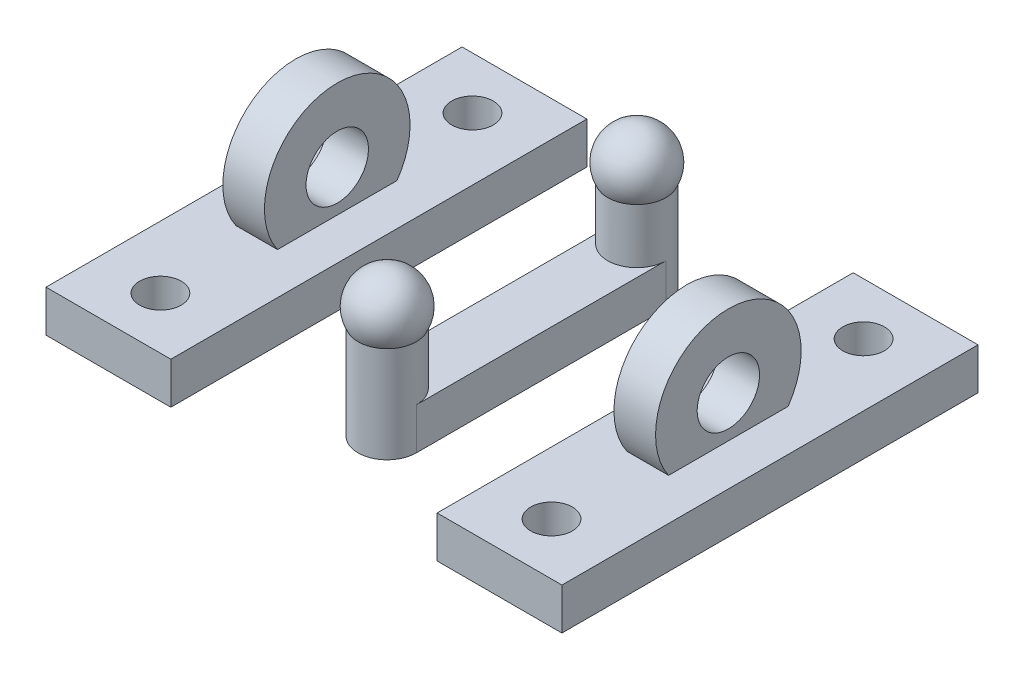
ISO-10303-21;
HEADER;
FILE_DESCRIPTION(('STEP AP214'),'2;1');
FILE_NAME('part.step','',(''),(''),'','','');
FILE_SCHEMA(('AUTOMOTIVE_DESIGN { 1 0 10303 214 1 1 1 1 }'));
ENDSEC;
DATA;
#1=APPLICATION_CONTEXT('core data for automotive mechanical design processes');
#2=APPLICATION_PROTOCOL_DEFINITION('international standard','automotive_design',2000,#1);
#3=PRODUCT_CONTEXT('',#1,'mechanical');
#4=PRODUCT('Part','Part','',(#3));
#5=PRODUCT_RELATED_PRODUCT_CATEGORY('part','',(#4));
#6=PRODUCT_DEFINITION_FORMATION('','',#4);
#7=PRODUCT_DEFINITION_CONTEXT('part definition',#1,'design');
#8=PRODUCT_DEFINITION('design','',#6,#7);
#9=PRODUCT_DEFINITION_SHAPE('','',#8);
#10=(LENGTH_UNIT() NAMED_UNIT(*) SI_UNIT(.MILLI.,.METRE.));
#11=(NAMED_UNIT(*) PLANE_ANGLE_UNIT() SI_UNIT($,.RADIAN.));
#12=(NAMED_UNIT(*) SI_UNIT($,.STERADIAN.) SOLID_ANGLE_UNIT());
#13=UNCERTAINTY_MEASURE_WITH_UNIT(LENGTH_MEASURE(1.E-05),#10,'distance_accuracy_value','');
#14=(GEOMETRIC_REPRESENTATION_CONTEXT(3) GLOBAL_UNCERTAINTY_ASSIGNED_CONTEXT((#13)) GLOBAL_UNIT_ASSIGNED_CONTEXT((#10,
#11,#12)) REPRESENTATION_CONTEXT('',''));
#15=CARTESIAN_POINT('',(0.,0.,0.));
#16=DIRECTION('',(0.,0.,1.));
#17=DIRECTION('',(1.,0.,0.));
#18=AXIS2_PLACEMENT_3D('',#15,#16,#17);
#19=CARTESIAN_POINT('',(0.,2.,0.));
#20=DIRECTION('',(0.,-1.,0.));
#21=DIRECTION('',(0.,0.,-1.));
#22=AXIS2_PLACEMENT_3D('',#19,#20,#21);
#23=PLANE('',#22);
#24=CARTESIAN_POINT('',(0.,2.,7.5));
#25=DIRECTION('',(0.,1.,0.));
#26=DIRECTION('',(0.,0.,1.));
#27=AXIS2_PLACEMENT_3D('',#24,#25,#26);
#28=CIRCLE('',#27,1.);
#29=CARTESIAN_POINT('',(0.,2.,8.5));
#30=VERTEX_POINT('',#29);
#31=EDGE_CURVE('P0_E184',#30,#30,#28,.T.);
#32=ORIENTED_EDGE('',*,*,#31,.F.);
#33=EDGE_LOOP('',(#32));
#34=FACE_BOUND('',#33,.T.);
#35=CARTESIAN_POINT('',(0.,2.,-7.5));
#36=DIRECTION('',(0.,1.,0.));
#37=DIRECTION('',(0.,0.,1.));
#38=AXIS2_PLACEMENT_3D('',#35,#36,#37);
#39=CIRCLE('',#38,1.);
#40=CARTESIAN_POINT('',(0.,2.,-6.5));
#41=VERTEX_POINT('',#40);
#42=EDGE_CURVE('P0_E185',#41,#41,#39,.T.);
#43=ORIENTED_EDGE('',*,*,#42,.F.);
#44=EDGE_LOOP('',(#43));
#45=FACE_BOUND('',#44,.T.);
#46=DIRECTION('',(-1.,0.,0.));
#47=VECTOR('',#46,1.);
#48=CARTESIAN_POINT('',(-3.,2.,-10.));
#49=LINE('',#48,#47);
#50=CARTESIAN_POINT('',(3.,2.,-10.));
#51=VERTEX_POINT('',#50);
#52=CARTESIAN_POINT('',(-3.,2.,-10.));
#53=VERTEX_POINT('',#52);
#54=EDGE_CURVE('P0_E68',#51,#53,#49,.T.);
#55=ORIENTED_EDGE('',*,*,#54,.T.);
#56=DIRECTION('',(0.,0.,1.));
#57=VECTOR('',#56,1.);
#58=CARTESIAN_POINT('',(-3.,2.,10.));
#59=LINE('',#58,#57);
#60=CARTESIAN_POINT('',(-3.,2.,10.));
#61=VERTEX_POINT('',#60);
#62=EDGE_CURVE('P0_E112',#53,#61,#59,.T.);
#63=ORIENTED_EDGE('',*,*,#62,.T.);
#64=DIRECTION('',(1.,0.,0.));
#65=VECTOR('',#64,1.);
#66=CARTESIAN_POINT('',(-3.,2.,10.));
#67=LINE('',#66,#65);
#68=CARTESIAN_POINT('',(3.,2.,10.));
#69=VERTEX_POINT('',#68);
#70=EDGE_CURVE('P0_E40',#61,#69,#67,.T.);
#71=ORIENTED_EDGE('',*,*,#70,.T.);
#72=DIRECTION('',(0.,0.,-1.));
#73=VECTOR('',#72,1.);
#74=CARTESIAN_POINT('',(3.,2.,10.));
#75=LINE('',#74,#73);
#76=EDGE_CURVE('P0_E109',#69,#51,#75,.T.);
#77=ORIENTED_EDGE('',*,*,#76,.T.);
#78=EDGE_LOOP('',(#55,#63,#71,#77));
#79=FACE_BOUND('',#78,.T.);
#80=DIRECTION('',(0.,0.,-1.));
#81=VECTOR('',#80,1.);
#82=CARTESIAN_POINT('',(1.,2.,0.));
#83=LINE('',#82,#81);
#84=CARTESIAN_POINT('',(1.,2.,2.87228132326901));
#85=VERTEX_POINT('',#84);
#86=CARTESIAN_POINT('',(1.,2.,-2.87228132326901));
#87=VERTEX_POINT('',#86);
#88=EDGE_CURVE('P0_E91',#85,#87,#83,.T.);
#89=ORIENTED_EDGE('',*,*,#88,.F.);
#90=DIRECTION('',(-1.,0.,0.));
#91=VECTOR('',#90,1.);
#92=CARTESIAN_POINT('',(1.,2.,2.87228132326901));
#93=LINE('',#92,#91);
#94=CARTESIAN_POINT('',(-1.,2.,2.87228132326901));
#95=VERTEX_POINT('',#94);
#96=EDGE_CURVE('P0_E82',#85,#95,#93,.T.);
#97=ORIENTED_EDGE('',*,*,#96,.T.);
#98=DIRECTION('',(0.,0.,-1.));
#99=VECTOR('',#98,1.);
#100=CARTESIAN_POINT('',(-1.,2.,0.));
#101=LINE('',#100,#99);
#102=CARTESIAN_POINT('',(-1.,2.,-2.87228132326901));
#103=VERTEX_POINT('',#102);
#104=EDGE_CURVE('P0_E77',#95,#103,#101,.T.);
#105=ORIENTED_EDGE('',*,*,#104,.T.);
#106=DIRECTION('',(-1.,0.,0.));
#107=VECTOR('',#106,1.);
#108=CARTESIAN_POINT('',(1.,2.,-2.87228132326901));
#109=LINE('',#108,#107);
#110=EDGE_CURVE('P0_E89',#87,#103,#109,.T.);
#111=ORIENTED_EDGE('',*,*,#110,.F.);
#112=EDGE_LOOP('',(#89,#97,#105,#111));
#113=FACE_BOUND('',#112,.T.);
#114=ADVANCED_FACE('P0_F17',(#34,#45,#79,#113),#23,.F.);
#115=CARTESIAN_POINT('',(3.,2.,10.));
#116=DIRECTION('',(-1.,0.,0.));
#117=DIRECTION('',(0.,0.,1.));
#118=AXIS2_PLACEMENT_3D('',#115,#116,#117);
#119=PLANE('',#118);
#120=DIRECTION('',(0.,0.,-1.));
#121=VECTOR('',#120,1.);
#122=CARTESIAN_POINT('',(3.,0.,10.));
#123=LINE('',#122,#121);
#124=CARTESIAN_POINT('',(3.,0.,10.));
#125=VERTEX_POINT('',#124);
#126=CARTESIAN_POINT('',(3.,0.,-10.));
#127=VERTEX_POINT('',#126);
#128=EDGE_CURVE('P0_E90',#125,#127,#123,.T.);
#129=ORIENTED_EDGE('',*,*,#128,.T.);
#130=DIRECTION('',(0.,-1.,0.));
#131=VECTOR('',#130,1.);
#132=CARTESIAN_POINT('',(3.,2.,-10.));
#133=LINE('',#132,#131);
#134=EDGE_CURVE('P0_E11',#51,#127,#133,.T.);
#135=ORIENTED_EDGE('',*,*,#134,.F.);
#136=ORIENTED_EDGE('',*,*,#76,.F.);
#137=DIRECTION('',(0.,-1.,0.));
#138=VECTOR('',#137,1.);
#139=CARTESIAN_POINT('',(3.,2.,10.));
#140=LINE('',#139,#138);
#141=EDGE_CURVE('P0_E115',#69,#125,#140,.T.);
#142=ORIENTED_EDGE('',*,*,#141,.T.);
#143=EDGE_LOOP('',(#129,#135,#136,#142));
#144=FACE_BOUND('',#143,.T.);
#145=ADVANCED_FACE('P0_F19',(#144),#119,.F.);
#146=CARTESIAN_POINT('',(-3.,2.,-10.));
#147=DIRECTION('',(0.,0.,1.));
#148=DIRECTION('',(1.,0.,0.));
#149=AXIS2_PLACEMENT_3D('',#146,#147,#148);
#150=PLANE('',#149);
#151=DIRECTION('',(0.,-1.,0.));
#152=VECTOR('',#151,1.);
#153=CARTESIAN_POINT('',(-3.,2.,-10.));
#154=LINE('',#153,#152);
#155=CARTESIAN_POINT('',(-3.,0.,-10.));
#156=VERTEX_POINT('',#155);
#157=EDGE_CURVE('P0_E25',#53,#156,#154,.T.);
#158=ORIENTED_EDGE('',*,*,#157,.F.);
#159=ORIENTED_EDGE('',*,*,#54,.F.);
#160=ORIENTED_EDGE('',*,*,#134,.T.);
#161=DIRECTION('',(-1.,0.,0.));
#162=VECTOR('',#161,1.);
#163=CARTESIAN_POINT('',(-3.,0.,-10.));
#164=LINE('',#163,#162);
#165=EDGE_CURVE('P0_E118',#127,#156,#164,.T.);
#166=ORIENTED_EDGE('',*,*,#165,.T.);
#167=EDGE_LOOP('',(#158,#159,#160,#166));
#168=FACE_BOUND('',#167,.T.);
#169=ADVANCED_FACE('P0_F148',(#168),#150,.F.);
#170=CARTESIAN_POINT('',(-3.,2.,10.));
#171=DIRECTION('',(1.,0.,0.));
#172=DIRECTION('',(0.,0.,-1.));
#173=AXIS2_PLACEMENT_3D('',#170,#171,#172);
#174=PLANE('',#173);
#175=DIRECTION('',(0.,0.,1.));
#176=VECTOR('',#175,1.);
#177=CARTESIAN_POINT('',(-3.,0.,10.));
#178=LINE('',#177,#176);
#179=CARTESIAN_POINT('',(-3.,0.,10.));
#180=VERTEX_POINT('',#179);
#181=EDGE_CURVE('P0_E120',#156,#180,#178,.T.);
#182=ORIENTED_EDGE('',*,*,#181,.T.);
#183=DIRECTION('',(0.,-1.,0.));
#184=VECTOR('',#183,1.);
#185=CARTESIAN_POINT('',(-3.,2.,10.));
#186=LINE('',#185,#184);
#187=EDGE_CURVE('P0_E124',#61,#180,#186,.T.);
#188=ORIENTED_EDGE('',*,*,#187,.F.);
#189=ORIENTED_EDGE('',*,*,#62,.F.);
#190=ORIENTED_EDGE('',*,*,#157,.T.);
#191=EDGE_LOOP('',(#182,#188,#189,#190));
#192=FACE_BOUND('',#191,.T.);
#193=ADVANCED_FACE('P0_F129',(#192),#174,.F.);
#194=CARTESIAN_POINT('',(-3.,2.,10.));
#195=DIRECTION('',(0.,0.,-1.));
#196=DIRECTION('',(-1.,0.,0.));
#197=AXIS2_PLACEMENT_3D('',#194,#195,#196);
#198=PLANE('',#197);
#199=DIRECTION('',(1.,0.,0.));
#200=VECTOR('',#199,1.);
#201=CARTESIAN_POINT('',(-3.,0.,10.));
#202=LINE('',#201,#200);
#203=EDGE_CURVE('P0_E61',#180,#125,#202,.T.);
#204=ORIENTED_EDGE('',*,*,#203,.T.);
#205=ORIENTED_EDGE('',*,*,#141,.F.);
#206=ORIENTED_EDGE('',*,*,#70,.F.);
#207=ORIENTED_EDGE('',*,*,#187,.T.);
#208=EDGE_LOOP('',(#204,#205,#206,#207));
#209=FACE_BOUND('',#208,.T.);
#210=ADVANCED_FACE('P0_F137',(#209),#198,.F.);
#211=CARTESIAN_POINT('',(0.,0.,0.));
#212=DIRECTION('',(0.,-1.,0.));
#213=DIRECTION('',(0.,0.,-1.));
#214=AXIS2_PLACEMENT_3D('',#211,#212,#213);
#215=PLANE('',#214);
#216=CARTESIAN_POINT('',(0.,0.,7.5));
#217=DIRECTION('',(0.,1.,0.));
#218=DIRECTION('',(0.,0.,1.));
#219=AXIS2_PLACEMENT_3D('',#216,#217,#218);
#220=CIRCLE('',#219,1.);
#221=CARTESIAN_POINT('',(0.,0.,8.5));
#222=VERTEX_POINT('',#221);
#223=EDGE_CURVE('P0_E83',#222,#222,#220,.T.);
#224=ORIENTED_EDGE('',*,*,#223,.T.);
#225=EDGE_LOOP('',(#224));
#226=FACE_BOUND('',#225,.T.);
#227=CARTESIAN_POINT('',(0.,0.,-7.5));
#228=DIRECTION('',(0.,1.,0.));
#229=DIRECTION('',(0.,0.,1.));
#230=AXIS2_PLACEMENT_3D('',#227,#228,#229);
#231=CIRCLE('',#230,1.);
#232=CARTESIAN_POINT('',(0.,0.,-6.5));
#233=VERTEX_POINT('',#232);
#234=EDGE_CURVE('P0_E101',#233,#233,#231,.T.);
#235=ORIENTED_EDGE('',*,*,#234,.T.);
#236=EDGE_LOOP('',(#235));
#237=FACE_BOUND('',#236,.T.);
#238=ORIENTED_EDGE('',*,*,#181,.F.);
#239=ORIENTED_EDGE('',*,*,#165,.F.);
#240=ORIENTED_EDGE('',*,*,#128,.F.);
#241=ORIENTED_EDGE('',*,*,#203,.F.);
#242=EDGE_LOOP('',(#238,#239,#240,#241));
#243=FACE_BOUND('',#242,.T.);
#244=ADVANCED_FACE('P0_F132',(#226,#237,#243),#215,.T.);
#245=CARTESIAN_POINT('',(1.,4.,0.));
#246=DIRECTION('',(-1.,0.,0.));
#247=DIRECTION('',(0.,0.,1.));
#248=AXIS2_PLACEMENT_3D('',#245,#246,#247);
#249=CYLINDRICAL_SURFACE('',#248,1.5);
#250=CARTESIAN_POINT('',(1.,4.,0.));
#251=DIRECTION('',(-1.,0.,0.));
#252=DIRECTION('',(0.,0.,1.));
#253=AXIS2_PLACEMENT_3D('',#250,#251,#252);
#254=CIRCLE('',#253,1.5);
#255=CARTESIAN_POINT('',(1.,4.,1.5));
#256=VERTEX_POINT('',#255);
#257=EDGE_CURVE('P0_E103',#256,#256,#254,.T.);
#258=ORIENTED_EDGE('',*,*,#257,.F.);
#259=EDGE_LOOP('',(#258));
#260=FACE_BOUND('',#259,.T.);
#261=CARTESIAN_POINT('',(-1.,4.,0.));
#262=DIRECTION('',(-1.,0.,0.));
#263=DIRECTION('',(0.,0.,1.));
#264=AXIS2_PLACEMENT_3D('',#261,#262,#263);
#265=CIRCLE('',#264,1.5);
#266=CARTESIAN_POINT('',(-1.,4.,1.5));
#267=VERTEX_POINT('',#266);
#268=EDGE_CURVE('P0_E94',#267,#267,#265,.T.);
#269=ORIENTED_EDGE('',*,*,#268,.T.);
#270=EDGE_LOOP('',(#269));
#271=FACE_BOUND('',#270,.T.);
#272=ADVANCED_FACE('P0_F145',(#260,#271),#249,.F.);
#273=CARTESIAN_POINT('',(1.,4.,0.));
#274=DIRECTION('',(-1.,0.,0.));
#275=DIRECTION('',(0.,0.,1.));
#276=AXIS2_PLACEMENT_3D('',#273,#274,#275);
#277=CYLINDRICAL_SURFACE('',#276,3.5);
#278=CARTESIAN_POINT('',(-1.,4.,0.));
#279=DIRECTION('',(-1.,0.,0.));
#280=DIRECTION('',(0.,0.,1.));
#281=AXIS2_PLACEMENT_3D('',#278,#279,#280);
#282=CIRCLE('',#281,3.5);
#283=EDGE_CURVE('P0_E31',#95,#103,#282,.T.);
#284=ORIENTED_EDGE('',*,*,#283,.F.);
#285=ORIENTED_EDGE('',*,*,#96,.F.);
#286=CARTESIAN_POINT('',(1.,4.,0.));
#287=DIRECTION('',(-1.,0.,0.));
#288=DIRECTION('',(0.,0.,1.));
#289=AXIS2_PLACEMENT_3D('',#286,#287,#288);
#290=CIRCLE('',#289,3.5);
#291=EDGE_CURVE('P0_E97',#85,#87,#290,.T.);
#292=ORIENTED_EDGE('',*,*,#291,.T.);
#293=ORIENTED_EDGE('',*,*,#110,.T.);
#294=EDGE_LOOP('',(#284,#285,#292,#293));
#295=FACE_BOUND('',#294,.T.);
#296=ADVANCED_FACE('P0_F86',(#295),#277,.T.);
#297=CARTESIAN_POINT('',(1.,0.,0.));
#298=DIRECTION('',(-1.,0.,0.));
#299=DIRECTION('',(0.,0.,1.));
#300=AXIS2_PLACEMENT_3D('',#297,#298,#299);
#301=PLANE('',#300);
#302=ORIENTED_EDGE('',*,*,#257,.T.);
#303=EDGE_LOOP('',(#302));
#304=FACE_BOUND('',#303,.T.);
#305=ORIENTED_EDGE('',*,*,#88,.T.);
#306=ORIENTED_EDGE('',*,*,#291,.F.);
#307=EDGE_LOOP('',(#305,#306));
#308=FACE_BOUND('',#307,.T.);
#309=ADVANCED_FACE('P0_F159',(#304,#308),#301,.F.);
#310=CARTESIAN_POINT('',(-1.,0.,0.));
#311=DIRECTION('',(-1.,0.,0.));
#312=DIRECTION('',(0.,0.,1.));
#313=AXIS2_PLACEMENT_3D('',#310,#311,#312);
#314=PLANE('',#313);
#315=ORIENTED_EDGE('',*,*,#268,.F.);
#316=EDGE_LOOP('',(#315));
#317=FACE_BOUND('',#316,.T.);
#318=ORIENTED_EDGE('',*,*,#104,.F.);
#319=ORIENTED_EDGE('',*,*,#283,.T.);
#320=EDGE_LOOP('',(#318,#319));
#321=FACE_BOUND('',#320,.T.);
#322=ADVANCED_FACE('P0_F78',(#317,#321),#314,.T.);
#323=CARTESIAN_POINT('',(0.,0.,-7.5));
#324=DIRECTION('',(0.,1.,0.));
#325=DIRECTION('',(0.,0.,1.));
#326=AXIS2_PLACEMENT_3D('',#323,#324,#325);
#327=CYLINDRICAL_SURFACE('',#326,1.);
#328=ORIENTED_EDGE('',*,*,#234,.F.);
#329=EDGE_LOOP('',(#328));
#330=FACE_BOUND('',#329,.T.);
#331=ORIENTED_EDGE('',*,*,#42,.T.);
#332=EDGE_LOOP('',(#331));
#333=FACE_BOUND('',#332,.T.);
#334=ADVANCED_FACE('P0_F165',(#330,#333),#327,.F.);
#335=CARTESIAN_POINT('',(0.,0.,7.5));
#336=DIRECTION('',(0.,1.,0.));
#337=DIRECTION('',(0.,0.,1.));
#338=AXIS2_PLACEMENT_3D('',#335,#336,#337);
#339=CYLINDRICAL_SURFACE('',#338,1.);
#340=ORIENTED_EDGE('',*,*,#223,.F.);
#341=EDGE_LOOP('',(#340));
#342=FACE_BOUND('',#341,.T.);
#343=ORIENTED_EDGE('',*,*,#31,.T.);
#344=EDGE_LOOP('',(#343));
#345=FACE_BOUND('',#344,.T.);
#346=ADVANCED_FACE('P0_F174',(#342,#345),#339,.F.);
#347=CLOSED_SHELL('',(#114,#145,#169,#193,#210,#244,#272,#296,#309,#322,#334,#346));
#348=MANIFOLD_SOLID_BREP('P0_B1',#347);
#349=CARTESIAN_POINT('',(-18.8,2.,0.));
#350=DIRECTION('',(0.,-1.,0.));
#351=DIRECTION('',(0.,0.,-1.));
#352=AXIS2_PLACEMENT_3D('',#349,#350,#351);
#353=PLANE('',#352);
#354=CARTESIAN_POINT('',(-18.8,2.,7.5));
#355=DIRECTION('',(0.,1.,0.));
#356=DIRECTION('',(0.,0.,1.));
#357=AXIS2_PLACEMENT_3D('',#354,#355,#356);
#358=CIRCLE('',#357,1.);
#359=CARTESIAN_POINT('',(-18.8,2.,8.5));
#360=VERTEX_POINT('',#359);
#361=EDGE_CURVE('P1_E183',#360,#360,#358,.T.);
#362=ORIENTED_EDGE('',*,*,#361,.F.);
#363=EDGE_LOOP('',(#362));
#364=FACE_BOUND('',#363,.T.);
#365=CARTESIAN_POINT('',(-18.8,2.,-7.5));
#366=DIRECTION('',(0.,1.,0.));
#367=DIRECTION('',(0.,0.,1.));
#368=AXIS2_PLACEMENT_3D('',#365,#366,#367);
#369=CIRCLE('',#368,1.);
#370=CARTESIAN_POINT('',(-18.8,2.,-6.5));
#371=VERTEX_POINT('',#370);
#372=EDGE_CURVE('P1_E184',#371,#371,#369,.T.);
#373=ORIENTED_EDGE('',*,*,#372,.F.);
#374=EDGE_LOOP('',(#373));
#375=FACE_BOUND('',#374,.T.);
#376=DIRECTION('',(-1.,0.,0.));
#377=VECTOR('',#376,1.);
#378=CARTESIAN_POINT('',(-21.8,2.,-10.));
#379=LINE('',#378,#377);
#380=CARTESIAN_POINT('',(-15.8,2.,-10.));
#381=VERTEX_POINT('',#380);
#382=CARTESIAN_POINT('',(-21.8,2.,-10.));
#383=VERTEX_POINT('',#382);
#384=EDGE_CURVE('P1_E67',#381,#383,#379,.T.);
#385=ORIENTED_EDGE('',*,*,#384,.T.);
#386=DIRECTION('',(0.,0.,1.));
#387=VECTOR('',#386,1.);
#388=CARTESIAN_POINT('',(-21.8,2.,10.));
#389=LINE('',#388,#387);
#390=CARTESIAN_POINT('',(-21.8,2.,10.));
#391=VERTEX_POINT('',#390);
#392=EDGE_CURVE('P1_E111',#383,#391,#389,.T.);
#393=ORIENTED_EDGE('',*,*,#392,.T.);
#394=DIRECTION('',(1.,0.,0.));
#395=VECTOR('',#394,1.);
#396=CARTESIAN_POINT('',(-21.8,2.,10.));
#397=LINE('',#396,#395);
#398=CARTESIAN_POINT('',(-15.8,2.,10.));
#399=VERTEX_POINT('',#398);
#400=EDGE_CURVE('P1_E39',#391,#399,#397,.T.);
#401=ORIENTED_EDGE('',*,*,#400,.T.);
#402=DIRECTION('',(0.,0.,-1.));
#403=VECTOR('',#402,1.);
#404=CARTESIAN_POINT('',(-15.8,2.,10.));
#405=LINE('',#404,#403);
#406=EDGE_CURVE('P1_E108',#399,#381,#405,.T.);
#407=ORIENTED_EDGE('',*,*,#406,.T.);
#408=EDGE_LOOP('',(#385,#393,#401,#407));
#409=FACE_BOUND('',#408,.T.);
#410=DIRECTION('',(0.,0.,-1.));
#411=VECTOR('',#410,1.);
#412=CARTESIAN_POINT('',(-17.8,2.,0.));
#413=LINE('',#412,#411);
#414=CARTESIAN_POINT('',(-17.8,2.,2.87228132326901));
#415=VERTEX_POINT('',#414);
#416=CARTESIAN_POINT('',(-17.8,2.,-2.87228132326901));
#417=VERTEX_POINT('',#416);
#418=EDGE_CURVE('P1_E90',#415,#417,#413,.T.);
#419=ORIENTED_EDGE('',*,*,#418,.F.);
#420=DIRECTION('',(-1.,0.,0.));
#421=VECTOR('',#420,1.);
#422=CARTESIAN_POINT('',(-17.8,2.,2.87228132326901));
#423=LINE('',#422,#421);
#424=CARTESIAN_POINT('',(-19.8,2.,2.87228132326901));
#425=VERTEX_POINT('',#424);
#426=EDGE_CURVE('P1_E81',#415,#425,#423,.T.);
#427=ORIENTED_EDGE('',*,*,#426,.T.);
#428=DIRECTION('',(0.,0.,-1.));
#429=VECTOR('',#428,1.);
#430=CARTESIAN_POINT('',(-19.8,2.,0.));
#431=LINE('',#430,#429);
#432=CARTESIAN_POINT('',(-19.8,2.,-2.87228132326901));
#433=VERTEX_POINT('',#432);
#434=EDGE_CURVE('P1_E76',#425,#433,#431,.T.);
#435=ORIENTED_EDGE('',*,*,#434,.T.);
#436=DIRECTION('',(-1.,0.,0.));
#437=VECTOR('',#436,1.);
#438=CARTESIAN_POINT('',(-17.8,2.,-2.87228132326901));
#439=LINE('',#438,#437);
#440=EDGE_CURVE('P1_E88',#417,#433,#439,.T.);
#441=ORIENTED_EDGE('',*,*,#440,.F.);
#442=EDGE_LOOP('',(#419,#427,#435,#441));
#443=FACE_BOUND('',#442,.T.);
#444=ADVANCED_FACE('P1_F16',(#364,#375,#409,#443),#353,.F.);
#445=CARTESIAN_POINT('',(-15.8,2.,10.));
#446=DIRECTION('',(-1.,0.,0.));
#447=DIRECTION('',(0.,0.,1.));
#448=AXIS2_PLACEMENT_3D('',#445,#446,#447);
#449=PLANE('',#448);
#450=DIRECTION('',(0.,0.,-1.));
#451=VECTOR('',#450,1.);
#452=CARTESIAN_POINT('',(-15.8,0.,10.));
#453=LINE('',#452,#451);
#454=CARTESIAN_POINT('',(-15.8,0.,10.));
#455=VERTEX_POINT('',#454);
#456=CARTESIAN_POINT('',(-15.8,0.,-10.));
#457=VERTEX_POINT('',#456);
#458=EDGE_CURVE('P1_E89',#455,#457,#453,.T.);
#459=ORIENTED_EDGE('',*,*,#458,.T.);
#460=DIRECTION('',(0.,-1.,0.));
#461=VECTOR('',#460,1.);
#462=CARTESIAN_POINT('',(-15.8,2.,-10.));
#463=LINE('',#462,#461);
#464=EDGE_CURVE('P1_E10',#381,#457,#463,.T.);
#465=ORIENTED_EDGE('',*,*,#464,.F.);
#466=ORIENTED_EDGE('',*,*,#406,.F.);
#467=DIRECTION('',(0.,-1.,0.));
#468=VECTOR('',#467,1.);
#469=CARTESIAN_POINT('',(-15.8,2.,10.));
#470=LINE('',#469,#468);
#471=EDGE_CURVE('P1_E114',#399,#455,#470,.T.);
#472=ORIENTED_EDGE('',*,*,#471,.T.);
#473=EDGE_LOOP('',(#459,#465,#466,#472));
#474=FACE_BOUND('',#473,.T.);
#475=ADVANCED_FACE('P1_F18',(#474),#449,.F.);
#476=CARTESIAN_POINT('',(-21.8,2.,-10.));
#477=DIRECTION('',(0.,0.,1.));
#478=DIRECTION('',(1.,0.,0.));
#479=AXIS2_PLACEMENT_3D('',#476,#477,#478);
#480=PLANE('',#479);
#481=DIRECTION('',(0.,-1.,0.));
#482=VECTOR('',#481,1.);
#483=CARTESIAN_POINT('',(-21.8,2.,-10.));
#484=LINE('',#483,#482);
#485=CARTESIAN_POINT('',(-21.8,0.,-10.));
#486=VERTEX_POINT('',#485);
#487=EDGE_CURVE('P1_E24',#383,#486,#484,.T.);
#488=ORIENTED_EDGE('',*,*,#487,.F.);
#489=ORIENTED_EDGE('',*,*,#384,.F.);
#490=ORIENTED_EDGE('',*,*,#464,.T.);
#491=DIRECTION('',(-1.,0.,0.));
#492=VECTOR('',#491,1.);
#493=CARTESIAN_POINT('',(-21.8,0.,-10.));
#494=LINE('',#493,#492);
#495=EDGE_CURVE('P1_E117',#457,#486,#494,.T.);
#496=ORIENTED_EDGE('',*,*,#495,.T.);
#497=EDGE_LOOP('',(#488,#489,#490,#496));
#498=FACE_BOUND('',#497,.T.);
#499=ADVANCED_FACE('P1_F147',(#498),#480,.F.);
#500=CARTESIAN_POINT('',(-21.8,2.,10.));
#501=DIRECTION('',(1.,0.,0.));
#502=DIRECTION('',(0.,0.,-1.));
#503=AXIS2_PLACEMENT_3D('',#500,#501,#502);
#504=PLANE('',#503);
#505=DIRECTION('',(0.,0.,1.));
#506=VECTOR('',#505,1.);
#507=CARTESIAN_POINT('',(-21.8,0.,10.));
#508=LINE('',#507,#506);
#509=CARTESIAN_POINT('',(-21.8,0.,10.));
#510=VERTEX_POINT('',#509);
#511=EDGE_CURVE('P1_E119',#486,#510,#508,.T.);
#512=ORIENTED_EDGE('',*,*,#511,.T.);
#513=DIRECTION('',(0.,-1.,0.));
#514=VECTOR('',#513,1.);
#515=CARTESIAN_POINT('',(-21.8,2.,10.));
#516=LINE('',#515,#514);
#517=EDGE_CURVE('P1_E123',#391,#510,#516,.T.);
#518=ORIENTED_EDGE('',*,*,#517,.F.);
#519=ORIENTED_EDGE('',*,*,#392,.F.);
#520=ORIENTED_EDGE('',*,*,#487,.T.);
#521=EDGE_LOOP('',(#512,#518,#519,#520));
#522=FACE_BOUND('',#521,.T.);
#523=ADVANCED_FACE('P1_F128',(#522),#504,.F.);
#524=CARTESIAN_POINT('',(-21.8,2.,10.));
#525=DIRECTION('',(0.,0.,-1.));
#526=DIRECTION('',(-1.,0.,0.));
#527=AXIS2_PLACEMENT_3D('',#524,#525,#526);
#528=PLANE('',#527);
#529=DIRECTION('',(1.,0.,0.));
#530=VECTOR('',#529,1.);
#531=CARTESIAN_POINT('',(-21.8,0.,10.));
#532=LINE('',#531,#530);
#533=EDGE_CURVE('P1_E60',#510,#455,#532,.T.);
#534=ORIENTED_EDGE('',*,*,#533,.T.);
#535=ORIENTED_EDGE('',*,*,#471,.F.);
#536=ORIENTED_EDGE('',*,*,#400,.F.);
#537=ORIENTED_EDGE('',*,*,#517,.T.);
#538=EDGE_LOOP('',(#534,#535,#536,#537));
#539=FACE_BOUND('',#538,.T.);
#540=ADVANCED_FACE('P1_F136',(#539),#528,.F.);
#541=CARTESIAN_POINT('',(-18.8,0.,0.));
#542=DIRECTION('',(0.,-1.,0.));
#543=DIRECTION('',(0.,0.,-1.));
#544=AXIS2_PLACEMENT_3D('',#541,#542,#543);
#545=PLANE('',#544);
#546=CARTESIAN_POINT('',(-18.8,0.,7.5));
#547=DIRECTION('',(0.,1.,0.));
#548=DIRECTION('',(0.,0.,1.));
#549=AXIS2_PLACEMENT_3D('',#546,#547,#548);
#550=CIRCLE('',#549,1.);
#551=CARTESIAN_POINT('',(-18.8,0.,8.5));
#552=VERTEX_POINT('',#551);
#553=EDGE_CURVE('P1_E82',#552,#552,#550,.T.);
#554=ORIENTED_EDGE('',*,*,#553,.T.);
#555=EDGE_LOOP('',(#554));
#556=FACE_BOUND('',#555,.T.);
#557=CARTESIAN_POINT('',(-18.8,0.,-7.5));
#558=DIRECTION('',(0.,1.,0.));
#559=DIRECTION('',(0.,0.,1.));
#560=AXIS2_PLACEMENT_3D('',#557,#558,#559);
#561=CIRCLE('',#560,1.);
#562=CARTESIAN_POINT('',(-18.8,0.,-6.5));
#563=VERTEX_POINT('',#562);
#564=EDGE_CURVE('P1_E100',#563,#563,#561,.T.);
#565=ORIENTED_EDGE('',*,*,#564,.T.);
#566=EDGE_LOOP('',(#565));
#567=FACE_BOUND('',#566,.T.);
#568=ORIENTED_EDGE('',*,*,#511,.F.);
#569=ORIENTED_EDGE('',*,*,#495,.F.);
#570=ORIENTED_EDGE('',*,*,#458,.F.);
#571=ORIENTED_EDGE('',*,*,#533,.F.);
#572=EDGE_LOOP('',(#568,#569,#570,#571));
#573=FACE_BOUND('',#572,.T.);
#574=ADVANCED_FACE('P1_F131',(#556,#567,#573),#545,.T.);
#575=CARTESIAN_POINT('',(-17.8,4.,0.));
#576=DIRECTION('',(-1.,0.,0.));
#577=DIRECTION('',(0.,0.,1.));
#578=AXIS2_PLACEMENT_3D('',#575,#576,#577);
#579=CYLINDRICAL_SURFACE('',#578,1.5);
#580=CARTESIAN_POINT('',(-17.8,4.,0.));
#581=DIRECTION('',(-1.,0.,0.));
#582=DIRECTION('',(0.,0.,1.));
#583=AXIS2_PLACEMENT_3D('',#580,#581,#582);
#584=CIRCLE('',#583,1.5);
#585=CARTESIAN_POINT('',(-17.8,4.,1.5));
#586=VERTEX_POINT('',#585);
#587=EDGE_CURVE('P1_E102',#586,#586,#584,.T.);
#588=ORIENTED_EDGE('',*,*,#587,.F.);
#589=EDGE_LOOP('',(#588));
#590=FACE_BOUND('',#589,.T.);
#591=CARTESIAN_POINT('',(-19.8,4.,0.));
#592=DIRECTION('',(-1.,0.,0.));
#593=DIRECTION('',(0.,0.,1.));
#594=AXIS2_PLACEMENT_3D('',#591,#592,#593);
#595=CIRCLE('',#594,1.5);
#596=CARTESIAN_POINT('',(-19.8,4.,1.5));
#597=VERTEX_POINT('',#596);
#598=EDGE_CURVE('P1_E93',#597,#597,#595,.T.);
#599=ORIENTED_EDGE('',*,*,#598,.T.);
#600=EDGE_LOOP('',(#599));
#601=FACE_BOUND('',#600,.T.);
#602=ADVANCED_FACE('P1_F144',(#590,#601),#579,.F.);
#603=CARTESIAN_POINT('',(-17.8,4.,0.));
#604=DIRECTION('',(-1.,0.,0.));
#605=DIRECTION('',(0.,0.,1.));
#606=AXIS2_PLACEMENT_3D('',#603,#604,#605);
#607=CYLINDRICAL_SURFACE('',#606,3.5);
#608=CARTESIAN_POINT('',(-19.8,4.,0.));
#609=DIRECTION('',(-1.,0.,0.));
#610=DIRECTION('',(0.,0.,1.));
#611=AXIS2_PLACEMENT_3D('',#608,#609,#610);
#612=CIRCLE('',#611,3.5);
#613=EDGE_CURVE('P1_E30',#425,#433,#612,.T.);
#614=ORIENTED_EDGE('',*,*,#613,.F.);
#615=ORIENTED_EDGE('',*,*,#426,.F.);
#616=CARTESIAN_POINT('',(-17.8,4.,0.));
#617=DIRECTION('',(-1.,0.,0.));
#618=DIRECTION('',(0.,0.,1.));
#619=AXIS2_PLACEMENT_3D('',#616,#617,#618);
#620=CIRCLE('',#619,3.5);
#621=EDGE_CURVE('P1_E96',#415,#417,#620,.T.);
#622=ORIENTED_EDGE('',*,*,#621,.T.);
#623=ORIENTED_EDGE('',*,*,#440,.T.);
#624=EDGE_LOOP('',(#614,#615,#622,#623));
#625=FACE_BOUND('',#624,.T.);
#626=ADVANCED_FACE('P1_F85',(#625),#607,.T.);
#627=CARTESIAN_POINT('',(-17.8,0.,0.));
#628=DIRECTION('',(-1.,0.,0.));
#629=DIRECTION('',(0.,0.,1.));
#630=AXIS2_PLACEMENT_3D('',#627,#628,#629);
#631=PLANE('',#630);
#632=ORIENTED_EDGE('',*,*,#587,.T.);
#633=EDGE_LOOP('',(#632));
#634=FACE_BOUND('',#633,.T.);
#635=ORIENTED_EDGE('',*,*,#418,.T.);
#636=ORIENTED_EDGE('',*,*,#621,.F.);
#637=EDGE_LOOP('',(#635,#636));
#638=FACE_BOUND('',#637,.T.);
#639=ADVANCED_FACE('P1_F158',(#634,#638),#631,.F.);
#640=CARTESIAN_POINT('',(-19.8,0.,0.));
#641=DIRECTION('',(-1.,0.,0.));
#642=DIRECTION('',(0.,0.,1.));
#643=AXIS2_PLACEMENT_3D('',#640,#641,#642);
#644=PLANE('',#643);
#645=ORIENTED_EDGE('',*,*,#598,.F.);
#646=EDGE_LOOP('',(#645));
#647=FACE_BOUND('',#646,.T.);
#648=ORIENTED_EDGE('',*,*,#434,.F.);
#649=ORIENTED_EDGE('',*,*,#613,.T.);
#650=EDGE_LOOP('',(#648,#649));
#651=FACE_BOUND('',#650,.T.);
#652=ADVANCED_FACE('P1_F77',(#647,#651),#644,.T.);
#653=CARTESIAN_POINT('',(-18.8,0.,-7.5));
#654=DIRECTION('',(0.,1.,0.));
#655=DIRECTION('',(0.,0.,1.));
#656=AXIS2_PLACEMENT_3D('',#653,#654,#655);
#657=CYLINDRICAL_SURFACE('',#656,1.);
#658=ORIENTED_EDGE('',*,*,#564,.F.);
#659=EDGE_LOOP('',(#658));
#660=FACE_BOUND('',#659,.T.);
#661=ORIENTED_EDGE('',*,*,#372,.T.);
#662=EDGE_LOOP('',(#661));
#663=FACE_BOUND('',#662,.T.);
#664=ADVANCED_FACE('P1_F164',(#660,#663),#657,.F.);
#665=CARTESIAN_POINT('',(-18.8,0.,7.5));
#666=DIRECTION('',(0.,1.,0.));
#667=DIRECTION('',(0.,0.,1.));
#668=AXIS2_PLACEMENT_3D('',#665,#666,#667);
#669=CYLINDRICAL_SURFACE('',#668,1.);
#670=ORIENTED_EDGE('',*,*,#553,.F.);
#671=EDGE_LOOP('',(#670));
#672=FACE_BOUND('',#671,.T.);
#673=ORIENTED_EDGE('',*,*,#361,.T.);
#674=EDGE_LOOP('',(#673));
#675=FACE_BOUND('',#674,.T.);
#676=ADVANCED_FACE('P1_F173',(#672,#675),#669,.F.);
#677=CLOSED_SHELL('',(#444,#475,#499,#523,#540,#574,#602,#626,#639,#652,#664,#676));
#678=MANIFOLD_SOLID_BREP('P1_B1',#677);
#679=CARTESIAN_POINT('',(-9.4,0.,6.));
#680=DIRECTION('',(0.,1.,0.));
#681=DIRECTION('',(1.,0.,0.));
#682=AXIS2_PLACEMENT_3D('',#679,#680,#681);
#683=PLANE('',#682);
#684=CARTESIAN_POINT('',(-9.4,0.,6.));
#685=DIRECTION('',(0.,-1.,0.));
#686=DIRECTION('',(-1.,0.,0.));
#687=AXIS2_PLACEMENT_3D('',#684,#685,#686);
#688=CIRCLE('',#687,1.4);
#689=CARTESIAN_POINT('',(-8.,0.,6.));
#690=VERTEX_POINT('',#689);
#691=CARTESIAN_POINT('',(-10.8,0.,6.));
#692=VERTEX_POINT('',#691);
#693=EDGE_CURVE('P2_E24',#690,#692,#688,.T.);
#694=ORIENTED_EDGE('',*,*,#693,.T.);
#695=DIRECTION('',(0.,0.,-1.));
#696=VECTOR('',#695,1.);
#697=CARTESIAN_POINT('',(-10.8,0.,6.));
#698=LINE('',#697,#696);
#699=CARTESIAN_POINT('',(-10.8,0.,-6.00000000000001));
#700=VERTEX_POINT('',#699);
#701=EDGE_CURVE('P2_E48',#692,#700,#698,.T.);
#702=ORIENTED_EDGE('',*,*,#701,.T.);
#703=CARTESIAN_POINT('',(-9.4,0.,-6.));
#704=DIRECTION('',(0.,1.,0.));
#705=DIRECTION('',(-1.,0.,0.));
#706=AXIS2_PLACEMENT_3D('',#703,#704,#705);
#707=CIRCLE('',#706,1.4);
#708=CARTESIAN_POINT('',(-8.,0.,-6.));
#709=VERTEX_POINT('',#708);
#710=EDGE_CURVE('P2_E79',#709,#700,#707,.T.);
#711=ORIENTED_EDGE('',*,*,#710,.F.);
#712=DIRECTION('',(0.,0.,1.));
#713=VECTOR('',#712,1.);
#714=CARTESIAN_POINT('',(-8.,0.,6.));
#715=LINE('',#714,#713);
#716=EDGE_CURVE('P2_E31',#709,#690,#715,.T.);
#717=ORIENTED_EDGE('',*,*,#716,.T.);
#718=EDGE_LOOP('',(#694,#702,#711,#717));
#719=FACE_BOUND('',#718,.T.);
#720=ADVANCED_FACE('P2_F17',(#719),#683,.F.);
#721=CARTESIAN_POINT('',(-9.4,-1.6476499031235,6.));
#722=DIRECTION('',(0.,-1.,0.));
#723=DIRECTION('',(-1.,0.,0.));
#724=AXIS2_PLACEMENT_3D('',#721,#722,#723);
#725=CYLINDRICAL_SURFACE('',#724,1.4);
#726=DIRECTION('',(0.,-1.,0.));
#727=VECTOR('',#726,1.);
#728=CARTESIAN_POINT('',(-10.8,2.,6.));
#729=LINE('',#728,#727);
#730=CARTESIAN_POINT('',(-10.8,2.,6.));
#731=VERTEX_POINT('',#730);
#732=EDGE_CURVE('P2_E40',#731,#692,#729,.T.);
#733=ORIENTED_EDGE('',*,*,#732,.T.);
#734=ORIENTED_EDGE('',*,*,#693,.F.);
#735=DIRECTION('',(0.,-1.,0.));
#736=VECTOR('',#735,1.);
#737=CARTESIAN_POINT('',(-8.,2.,6.));
#738=LINE('',#737,#736);
#739=CARTESIAN_POINT('',(-8.,2.,6.));
#740=VERTEX_POINT('',#739);
#741=EDGE_CURVE('P2_E86',#740,#690,#738,.T.);
#742=ORIENTED_EDGE('',*,*,#741,.F.);
#743=CARTESIAN_POINT('',(-9.4,2.,6.));
#744=DIRECTION('',(0.,1.,0.));
#745=DIRECTION('',(1.,0.,0.));
#746=AXIS2_PLACEMENT_3D('',#743,#744,#745);
#747=CIRCLE('',#746,1.4);
#748=EDGE_CURVE('P2_E11',#731,#740,#747,.F.);
#749=ORIENTED_EDGE('',*,*,#748,.F.);
#750=EDGE_LOOP('',(#733,#734,#742,#749));
#751=FACE_BOUND('',#750,.T.);
#752=CARTESIAN_POINT('',(-9.4,4.62540333075852,6.));
#753=DIRECTION('',(0.,-1.,0.));
#754=DIRECTION('',(-1.,0.,0.));
#755=AXIS2_PLACEMENT_3D('',#752,#753,#754);
#756=CIRCLE('',#755,1.4);
#757=CARTESIAN_POINT('',(-10.8,4.62540333075852,6.));
#758=VERTEX_POINT('',#757);
#759=EDGE_CURVE('P2_E90',#758,#758,#756,.T.);
#760=ORIENTED_EDGE('',*,*,#759,.T.);
#761=EDGE_LOOP('',(#760));
#762=FACE_BOUND('',#761,.T.);
#763=ADVANCED_FACE('P2_F95',(#751,#762),#725,.T.);
#764=CARTESIAN_POINT('',(-9.4,5.4,6.));
#765=DIRECTION('',(0.,-1.,0.));
#766=DIRECTION('',(-1.,0.,0.));
#767=AXIS2_PLACEMENT_3D('',#764,#765,#766);
#768=SPHERICAL_SURFACE('',#767,1.6);
#769=ORIENTED_EDGE('',*,*,#759,.F.);
#770=EDGE_LOOP('',(#769));
#771=FACE_BOUND('',#770,.T.);
#772=ADVANCED_FACE('P2_F98',(#771),#768,.T.);
#773=CARTESIAN_POINT('',(-8.,2.,6.));
#774=DIRECTION('',(1.,0.,0.));
#775=DIRECTION('',(0.,-1.,0.));
#776=AXIS2_PLACEMENT_3D('',#773,#774,#775);
#777=PLANE('',#776);
#778=ORIENTED_EDGE('',*,*,#716,.F.);
#779=DIRECTION('',(0.,-1.,0.));
#780=VECTOR('',#779,1.);
#781=CARTESIAN_POINT('',(-8.,2.,-6.));
#782=LINE('',#781,#780);
#783=CARTESIAN_POINT('',(-8.,2.,-6.));
#784=VERTEX_POINT('',#783);
#785=EDGE_CURVE('P2_E71',#784,#709,#782,.T.);
#786=ORIENTED_EDGE('',*,*,#785,.F.);
#787=DIRECTION('',(0.,0.,1.));
#788=VECTOR('',#787,1.);
#789=CARTESIAN_POINT('',(-8.,2.,6.));
#790=LINE('',#789,#788);
#791=EDGE_CURVE('P2_E62',#784,#740,#790,.T.);
#792=ORIENTED_EDGE('',*,*,#791,.T.);
#793=ORIENTED_EDGE('',*,*,#741,.T.);
#794=EDGE_LOOP('',(#778,#786,#792,#793));
#795=FACE_BOUND('',#794,.T.);
#796=ADVANCED_FACE('P2_F72',(#795),#777,.T.);
#797=CARTESIAN_POINT('',(-10.8,2.,6.));
#798=DIRECTION('',(-1.,0.,0.));
#799=DIRECTION('',(0.,0.,1.));
#800=AXIS2_PLACEMENT_3D('',#797,#798,#799);
#801=PLANE('',#800);
#802=ORIENTED_EDGE('',*,*,#701,.F.);
#803=ORIENTED_EDGE('',*,*,#732,.F.);
#804=DIRECTION('',(0.,0.,-1.));
#805=VECTOR('',#804,1.);
#806=CARTESIAN_POINT('',(-10.8,2.,6.));
#807=LINE('',#806,#805);
#808=CARTESIAN_POINT('',(-10.8,2.,-6.00000000000001));
#809=VERTEX_POINT('',#808);
#810=EDGE_CURVE('P2_E69',#731,#809,#807,.T.);
#811=ORIENTED_EDGE('',*,*,#810,.T.);
#812=DIRECTION('',(0.,-1.,0.));
#813=VECTOR('',#812,1.);
#814=CARTESIAN_POINT('',(-10.8,2.,-6.00000000000001));
#815=LINE('',#814,#813);
#816=EDGE_CURVE('P2_E75',#809,#700,#815,.T.);
#817=ORIENTED_EDGE('',*,*,#816,.T.);
#818=EDGE_LOOP('',(#802,#803,#811,#817));
#819=FACE_BOUND('',#818,.T.);
#820=ADVANCED_FACE('P2_F107',(#819),#801,.T.);
#821=CARTESIAN_POINT('',(-9.4,2.,6.));
#822=DIRECTION('',(0.,1.,0.));
#823=DIRECTION('',(1.,0.,0.));
#824=AXIS2_PLACEMENT_3D('',#821,#822,#823);
#825=PLANE('',#824);
#826=ORIENTED_EDGE('',*,*,#810,.F.);
#827=ORIENTED_EDGE('',*,*,#748,.T.);
#828=ORIENTED_EDGE('',*,*,#791,.F.);
#829=CARTESIAN_POINT('',(-9.4,2.,-6.));
#830=DIRECTION('',(0.,-1.,0.));
#831=DIRECTION('',(1.,0.,0.));
#832=AXIS2_PLACEMENT_3D('',#829,#830,#831);
#833=CIRCLE('',#832,1.4);
#834=EDGE_CURVE('P2_E65',#809,#784,#833,.F.);
#835=ORIENTED_EDGE('',*,*,#834,.F.);
#836=EDGE_LOOP('',(#826,#827,#828,#835));
#837=FACE_BOUND('',#836,.T.);
#838=ADVANCED_FACE('P2_F63',(#837),#825,.T.);
#839=CARTESIAN_POINT('',(-9.4,-1.6476499031235,-6.));
#840=DIRECTION('',(0.,-1.,0.));
#841=DIRECTION('',(-1.,0.,0.));
#842=AXIS2_PLACEMENT_3D('',#839,#840,#841);
#843=CYLINDRICAL_SURFACE('',#842,1.4);
#844=ORIENTED_EDGE('',*,*,#816,.F.);
#845=ORIENTED_EDGE('',*,*,#834,.T.);
#846=ORIENTED_EDGE('',*,*,#785,.T.);
#847=ORIENTED_EDGE('',*,*,#710,.T.);
#848=EDGE_LOOP('',(#844,#845,#846,#847));
#849=FACE_BOUND('',#848,.T.);
#850=CARTESIAN_POINT('',(-9.4,4.62540333075852,-6.));
#851=DIRECTION('',(0.,1.,0.));
#852=DIRECTION('',(-1.,0.,0.));
#853=AXIS2_PLACEMENT_3D('',#850,#851,#852);
#854=CIRCLE('',#853,1.4);
#855=CARTESIAN_POINT('',(-10.8,4.62540333075852,-6.00000000000001));
#856=VERTEX_POINT('',#855);
#857=EDGE_CURVE('P2_E82',#856,#856,#854,.T.);
#858=ORIENTED_EDGE('',*,*,#857,.F.);
#859=EDGE_LOOP('',(#858));
#860=FACE_BOUND('',#859,.T.);
#861=ADVANCED_FACE('P2_F77',(#849,#860),#843,.T.);
#862=CARTESIAN_POINT('',(-9.4,5.4,-6.));
#863=DIRECTION('',(0.,-1.,0.));
#864=DIRECTION('',(-1.,0.,0.));
#865=AXIS2_PLACEMENT_3D('',#862,#863,#864);
#866=SPHERICAL_SURFACE('',#865,1.6);
#867=ORIENTED_EDGE('',*,*,#857,.T.);
#868=EDGE_LOOP('',(#867));
#869=FACE_BOUND('',#868,.T.);
#870=ADVANCED_FACE('P2_F161',(#869),#866,.T.);
#871=CLOSED_SHELL('',(#720,#763,#772,#796,#820,#838,#861,#870));
#872=MANIFOLD_SOLID_BREP('P2_B1',#871);
#873=ADVANCED_BREP_SHAPE_REPRESENTATION('',(#18,#348,#678,#872),#14);
#874=SHAPE_DEFINITION_REPRESENTATION(#9,#873);
ENDSEC;
END-ISO-10303-21;
